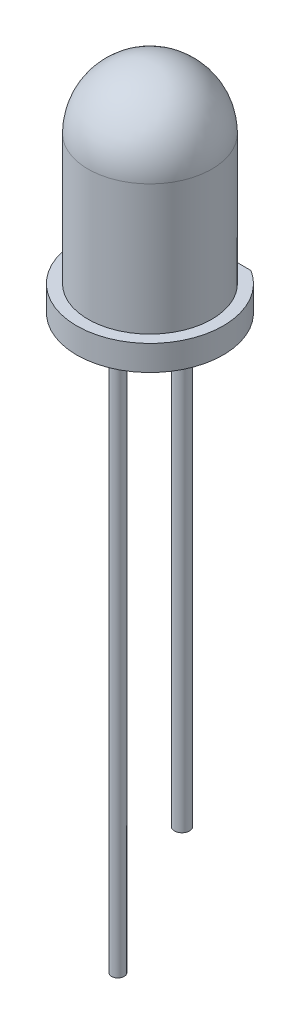
ISO-10303-21;
HEADER;
FILE_DESCRIPTION(('STEP AP214'),'2;1');
FILE_NAME('part.step','',(''),(''),'','','');
FILE_SCHEMA(('AUTOMOTIVE_DESIGN { 1 0 10303 214 1 1 1 1 }'));
ENDSEC;
DATA;
#1=APPLICATION_CONTEXT('core data for automotive mechanical design processes');
#2=APPLICATION_PROTOCOL_DEFINITION('international standard','automotive_design',2000,#1);
#3=PRODUCT_CONTEXT('',#1,'mechanical');
#4=PRODUCT('Part','Part','',(#3));
#5=PRODUCT_RELATED_PRODUCT_CATEGORY('part','',(#4));
#6=PRODUCT_DEFINITION_FORMATION('','',#4);
#7=PRODUCT_DEFINITION_CONTEXT('part definition',#1,'design');
#8=PRODUCT_DEFINITION('design','',#6,#7);
#9=PRODUCT_DEFINITION_SHAPE('','',#8);
#10=(LENGTH_UNIT() NAMED_UNIT(*) SI_UNIT(.MILLI.,.METRE.));
#11=(NAMED_UNIT(*) PLANE_ANGLE_UNIT() SI_UNIT($,.RADIAN.));
#12=(NAMED_UNIT(*) SI_UNIT($,.STERADIAN.) SOLID_ANGLE_UNIT());
#13=UNCERTAINTY_MEASURE_WITH_UNIT(LENGTH_MEASURE(1.E-05),#10,'distance_accuracy_value','');
#14=(GEOMETRIC_REPRESENTATION_CONTEXT(3) GLOBAL_UNCERTAINTY_ASSIGNED_CONTEXT((#13)) GLOBAL_UNIT_ASSIGNED_CONTEXT((#10,
#11,#12)) REPRESENTATION_CONTEXT('',''));
#15=CARTESIAN_POINT('',(0.,0.,0.));
#16=DIRECTION('',(0.,0.,1.));
#17=DIRECTION('',(1.,0.,0.));
#18=AXIS2_PLACEMENT_3D('',#15,#16,#17);
#19=CARTESIAN_POINT('',(0.,0.,0.));
#20=DIRECTION('',(0.,-1.,0.));
#21=DIRECTION('',(0.,0.,-1.));
#22=AXIS2_PLACEMENT_3D('',#19,#20,#21);
#23=PLANE('',#22);
#24=CARTESIAN_POINT('',(0.,0.,1.27));
#25=DIRECTION('',(0.,-1.,0.));
#26=DIRECTION('',(0.,0.,-1.));
#27=AXIS2_PLACEMENT_3D('',#24,#25,#26);
#28=CIRCLE('',#27,0.25);
#29=CARTESIAN_POINT('',(0.,0.,1.02));
#30=VERTEX_POINT('',#29);
#31=EDGE_CURVE('E12',#30,#30,#28,.T.);
#32=ORIENTED_EDGE('',*,*,#31,.F.);
#33=EDGE_LOOP('',(#32));
#34=FACE_BOUND('',#33,.T.);
#35=CARTESIAN_POINT('',(0.,0.,-1.27));
#36=DIRECTION('',(0.,-1.,0.));
#37=DIRECTION('',(0.,0.,-1.));
#38=AXIS2_PLACEMENT_3D('',#35,#36,#37);
#39=CIRCLE('',#38,0.3);
#40=CARTESIAN_POINT('',(0.,0.,-1.57));
#41=VERTEX_POINT('',#40);
#42=EDGE_CURVE('E53',#41,#41,#39,.T.);
#43=ORIENTED_EDGE('',*,*,#42,.F.);
#44=EDGE_LOOP('',(#43));
#45=FACE_BOUND('',#44,.T.);
#46=DIRECTION('',(-1.,0.,0.));
#47=VECTOR('',#46,1.);
#48=CARTESIAN_POINT('',(0.,0.,-2.45));
#49=LINE('',#48,#47);
#50=CARTESIAN_POINT('',(1.55161206491829,0.,-2.45));
#51=VERTEX_POINT('',#50);
#52=CARTESIAN_POINT('',(-1.55161206491829,0.,-2.45));
#53=VERTEX_POINT('',#52);
#54=EDGE_CURVE('E66',#51,#53,#49,.T.);
#55=ORIENTED_EDGE('',*,*,#54,.F.);
#56=CARTESIAN_POINT('',(0.,0.,0.));
#57=DIRECTION('',(0.,-1.,0.));
#58=DIRECTION('',(0.,0.,-1.));
#59=AXIS2_PLACEMENT_3D('',#56,#57,#58);
#60=CIRCLE('',#59,2.9);
#61=EDGE_CURVE('E104',#51,#53,#60,.T.);
#62=ORIENTED_EDGE('',*,*,#61,.T.);
#63=EDGE_LOOP('',(#55,#62));
#64=FACE_BOUND('',#63,.T.);
#65=ADVANCED_FACE('F46',(#34,#45,#64),#23,.T.);
#66=CARTESIAN_POINT('',(0.,0.,0.));
#67=DIRECTION('',(0.,-1.,0.));
#68=DIRECTION('',(0.,0.,-1.));
#69=AXIS2_PLACEMENT_3D('',#66,#67,#68);
#70=CYLINDRICAL_SURFACE('',#69,2.9);
#71=DIRECTION('',(0.,-1.,0.));
#72=VECTOR('',#71,1.);
#73=CARTESIAN_POINT('',(-1.55161206491829,0.,-2.45));
#74=LINE('',#73,#72);
#75=CARTESIAN_POINT('',(-1.55161206491829,1.,-2.45));
#76=VERTEX_POINT('',#75);
#77=EDGE_CURVE('E93',#53,#76,#74,.F.);
#78=ORIENTED_EDGE('',*,*,#77,.F.);
#79=ORIENTED_EDGE('',*,*,#61,.F.);
#80=DIRECTION('',(0.,-1.,0.));
#81=VECTOR('',#80,1.);
#82=CARTESIAN_POINT('',(1.55161206491829,0.,-2.45));
#83=LINE('',#82,#81);
#84=CARTESIAN_POINT('',(1.55161206491829,1.,-2.45));
#85=VERTEX_POINT('',#84);
#86=EDGE_CURVE('E90',#85,#51,#83,.T.);
#87=ORIENTED_EDGE('',*,*,#86,.F.);
#88=CARTESIAN_POINT('',(0.,1.,0.));
#89=DIRECTION('',(0.,-1.,0.));
#90=DIRECTION('',(0.,0.,-1.));
#91=AXIS2_PLACEMENT_3D('',#88,#89,#90);
#92=CIRCLE('',#91,2.9);
#93=EDGE_CURVE('E101',#85,#76,#92,.T.);
#94=ORIENTED_EDGE('',*,*,#93,.T.);
#95=EDGE_LOOP('',(#78,#79,#87,#94));
#96=FACE_BOUND('',#95,.T.);
#97=ADVANCED_FACE('F113',(#96),#70,.T.);
#98=CARTESIAN_POINT('',(0.,1.,-2.45));
#99=DIRECTION('',(0.,1.,0.));
#100=DIRECTION('',(0.,0.,1.));
#101=AXIS2_PLACEMENT_3D('',#98,#99,#100);
#102=PLANE('',#101);
#103=DIRECTION('',(1.,0.,0.));
#104=VECTOR('',#103,1.);
#105=CARTESIAN_POINT('',(0.,1.,-2.45));
#106=LINE('',#105,#104);
#107=CARTESIAN_POINT('',(0.,1.,-2.45));
#108=VERTEX_POINT('',#107);
#109=EDGE_CURVE('E60',#76,#108,#106,.T.);
#110=ORIENTED_EDGE('',*,*,#109,.F.);
#111=ORIENTED_EDGE('',*,*,#93,.F.);
#112=EDGE_CURVE('E86',#108,#85,#106,.T.);
#113=ORIENTED_EDGE('',*,*,#112,.F.);
#114=CARTESIAN_POINT('',(0.,1.,0.));
#115=DIRECTION('',(0.,-1.,0.));
#116=DIRECTION('',(0.,0.,-1.));
#117=AXIS2_PLACEMENT_3D('',#114,#115,#116);
#118=CIRCLE('',#117,2.45);
#119=EDGE_CURVE('E98',#108,#108,#118,.T.);
#120=ORIENTED_EDGE('',*,*,#119,.T.);
#121=EDGE_LOOP('',(#110,#111,#113,#120));
#122=FACE_BOUND('',#121,.T.);
#123=ADVANCED_FACE('F121',(#122),#102,.T.);
#124=CARTESIAN_POINT('',(0.,0.,0.));
#125=DIRECTION('',(0.,-1.,0.));
#126=DIRECTION('',(0.,0.,-1.));
#127=AXIS2_PLACEMENT_3D('',#124,#125,#126);
#128=CYLINDRICAL_SURFACE('',#127,2.45);
#129=CARTESIAN_POINT('',(0.,6.15,0.));
#130=DIRECTION('',(0.,-1.,0.));
#131=DIRECTION('',(0.,0.,-1.));
#132=AXIS2_PLACEMENT_3D('',#129,#130,#131);
#133=CIRCLE('',#132,2.45);
#134=CARTESIAN_POINT('',(0.,6.15,-2.45));
#135=VERTEX_POINT('',#134);
#136=EDGE_CURVE('E95',#135,#135,#133,.T.);
#137=ORIENTED_EDGE('',*,*,#136,.T.);
#138=EDGE_LOOP('',(#137));
#139=FACE_BOUND('',#138,.T.);
#140=ORIENTED_EDGE('',*,*,#119,.F.);
#141=EDGE_LOOP('',(#140));
#142=FACE_BOUND('',#141,.T.);
#143=ADVANCED_FACE('F124',(#139,#142),#128,.T.);
#144=CARTESIAN_POINT('',(0.,6.15,0.));
#145=DIRECTION('',(0.,-1.,0.));
#146=DIRECTION('',(0.,0.,-1.));
#147=AXIS2_PLACEMENT_3D('',#144,#145,#146);
#148=SPHERICAL_SURFACE('',#147,2.45);
#149=ORIENTED_EDGE('',*,*,#136,.F.);
#150=EDGE_LOOP('',(#149));
#151=FACE_BOUND('',#150,.T.);
#152=ADVANCED_FACE('F126',(#151),#148,.T.);
#153=CARTESIAN_POINT('',(0.,-9.,-2.45));
#154=DIRECTION('',(0.,0.,1.));
#155=DIRECTION('',(1.,0.,0.));
#156=AXIS2_PLACEMENT_3D('',#153,#154,#155);
#157=PLANE('',#156);
#158=ORIENTED_EDGE('',*,*,#77,.T.);
#159=ORIENTED_EDGE('',*,*,#109,.T.);
#160=ORIENTED_EDGE('',*,*,#112,.T.);
#161=ORIENTED_EDGE('',*,*,#86,.T.);
#162=ORIENTED_EDGE('',*,*,#54,.T.);
#163=EDGE_LOOP('',(#158,#159,#160,#161,#162));
#164=FACE_BOUND('',#163,.T.);
#165=ADVANCED_FACE('F119',(#164),#157,.F.);
#166=CARTESIAN_POINT('',(0.,-18.255708098174,-1.27));
#167=DIRECTION('',(0.,-1.,0.));
#168=DIRECTION('',(0.,0.,-1.));
#169=AXIS2_PLACEMENT_3D('',#166,#167,#168);
#170=PLANE('',#169);
#171=CARTESIAN_POINT('',(0.,-18.255708098174,-1.27));
#172=DIRECTION('',(0.,-1.,0.));
#173=DIRECTION('',(0.,0.,-1.));
#174=AXIS2_PLACEMENT_3D('',#171,#172,#173);
#175=CIRCLE('',#174,0.3);
#176=CARTESIAN_POINT('',(0.,-18.255708098174,-1.57));
#177=VERTEX_POINT('',#176);
#178=EDGE_CURVE('E84',#177,#177,#175,.T.);
#179=ORIENTED_EDGE('',*,*,#178,.T.);
#180=EDGE_LOOP('',(#179));
#181=FACE_BOUND('',#180,.T.);
#182=ADVANCED_FACE('F155',(#181),#170,.T.);
#183=CARTESIAN_POINT('',(0.,0.,-1.27));
#184=DIRECTION('',(0.,-1.,0.));
#185=DIRECTION('',(0.,0.,-1.));
#186=AXIS2_PLACEMENT_3D('',#183,#184,#185);
#187=CYLINDRICAL_SURFACE('',#186,0.3);
#188=ORIENTED_EDGE('',*,*,#178,.F.);
#189=EDGE_LOOP('',(#188));
#190=FACE_BOUND('',#189,.T.);
#191=ORIENTED_EDGE('',*,*,#42,.T.);
#192=EDGE_LOOP('',(#191));
#193=FACE_BOUND('',#192,.T.);
#194=ADVANCED_FACE('F109',(#190,#193),#187,.T.);
#195=CARTESIAN_POINT('',(0.,-22.,1.27));
#196=DIRECTION('',(0.,-1.,0.));
#197=DIRECTION('',(0.,0.,-1.));
#198=AXIS2_PLACEMENT_3D('',#195,#196,#197);
#199=PLANE('',#198);
#200=CARTESIAN_POINT('',(0.,-22.,1.27));
#201=DIRECTION('',(0.,-1.,0.));
#202=DIRECTION('',(0.,0.,-1.));
#203=AXIS2_PLACEMENT_3D('',#200,#201,#202);
#204=CIRCLE('',#203,0.25);
#205=CARTESIAN_POINT('',(0.,-22.,1.02));
#206=VERTEX_POINT('',#205);
#207=EDGE_CURVE('E81',#206,#206,#204,.T.);
#208=ORIENTED_EDGE('',*,*,#207,.T.);
#209=EDGE_LOOP('',(#208));
#210=FACE_BOUND('',#209,.T.);
#211=ADVANCED_FACE('F82',(#210),#199,.T.);
#212=CARTESIAN_POINT('',(0.,0.,1.27));
#213=DIRECTION('',(0.,-1.,0.));
#214=DIRECTION('',(0.,0.,-1.));
#215=AXIS2_PLACEMENT_3D('',#212,#213,#214);
#216=CYLINDRICAL_SURFACE('',#215,0.25);
#217=ORIENTED_EDGE('',*,*,#207,.F.);
#218=EDGE_LOOP('',(#217));
#219=FACE_BOUND('',#218,.T.);
#220=ORIENTED_EDGE('',*,*,#31,.T.);
#221=EDGE_LOOP('',(#220));
#222=FACE_BOUND('',#221,.T.);
#223=ADVANCED_FACE('F167',(#219,#222),#216,.T.);
#224=CLOSED_SHELL('',(#65,#97,#123,#143,#152,#165,#182,#194,#211,#223));
#225=MANIFOLD_SOLID_BREP('B2',#224);
#226=ADVANCED_BREP_SHAPE_REPRESENTATION('',(#18,#225),#14);
#227=SHAPE_DEFINITION_REPRESENTATION(#9,#226);
ENDSEC;
END-ISO-10303-21;
